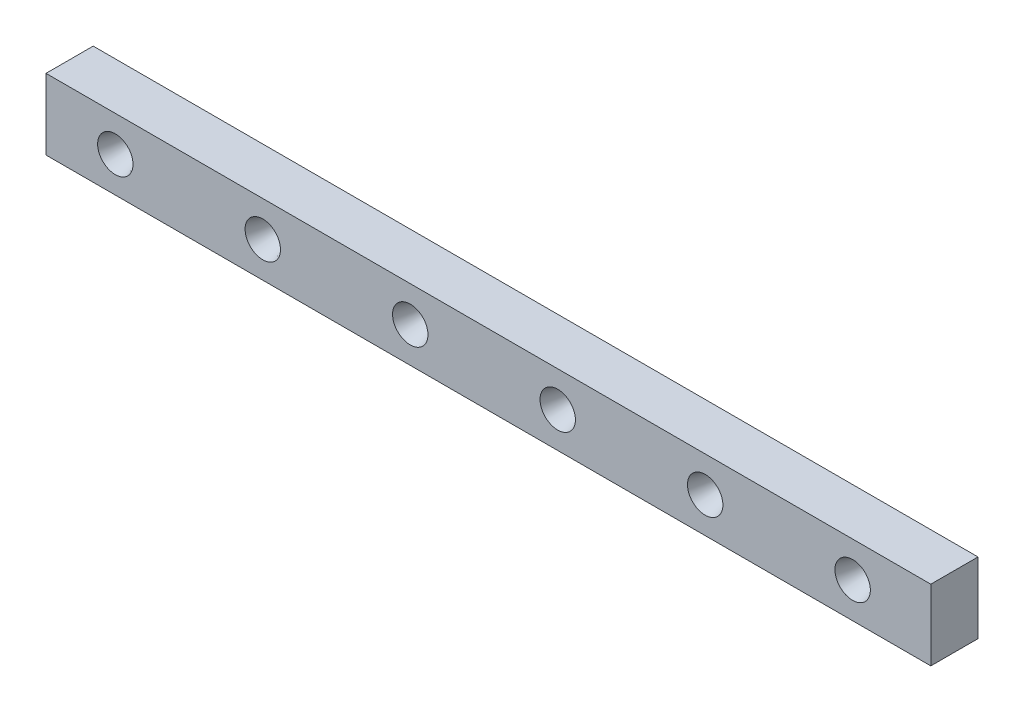
ISO-10303-21;
HEADER;
FILE_DESCRIPTION(('STEP AP214'),'2;1');
FILE_NAME('part.step','',(''),(''),'','','');
FILE_SCHEMA(('AUTOMOTIVE_DESIGN { 1 0 10303 214 1 1 1 1 }'));
ENDSEC;
DATA;
#1=APPLICATION_CONTEXT('core data for automotive mechanical design processes');
#2=APPLICATION_PROTOCOL_DEFINITION('international standard','automotive_design',2000,#1);
#3=PRODUCT_CONTEXT('',#1,'mechanical');
#4=PRODUCT('Part','Part','',(#3));
#5=PRODUCT_RELATED_PRODUCT_CATEGORY('part','',(#4));
#6=PRODUCT_DEFINITION_FORMATION('','',#4);
#7=PRODUCT_DEFINITION_CONTEXT('part definition',#1,'design');
#8=PRODUCT_DEFINITION('design','',#6,#7);
#9=PRODUCT_DEFINITION_SHAPE('','',#8);
#10=(LENGTH_UNIT() NAMED_UNIT(*) SI_UNIT(.MILLI.,.METRE.));
#11=(NAMED_UNIT(*) PLANE_ANGLE_UNIT() SI_UNIT($,.RADIAN.));
#12=(NAMED_UNIT(*) SI_UNIT($,.STERADIAN.) SOLID_ANGLE_UNIT());
#13=UNCERTAINTY_MEASURE_WITH_UNIT(LENGTH_MEASURE(1.E-05),#10,'distance_accuracy_value','');
#14=(GEOMETRIC_REPRESENTATION_CONTEXT(3) GLOBAL_UNCERTAINTY_ASSIGNED_CONTEXT((#13)) GLOBAL_UNIT_ASSIGNED_CONTEXT((#10,
#11,#12)) REPRESENTATION_CONTEXT('',''));
#15=CARTESIAN_POINT('',(0.,0.,0.));
#16=DIRECTION('',(0.,0.,1.));
#17=DIRECTION('',(1.,0.,0.));
#18=AXIS2_PLACEMENT_3D('',#15,#16,#17);
#19=CARTESIAN_POINT('',(150.,6.,4.));
#20=DIRECTION('',(0.,0.,-1.));
#21=DIRECTION('',(0.,1.,0.));
#22=AXIS2_PLACEMENT_3D('',#19,#20,#21);
#23=PLANE('',#22);
#24=CARTESIAN_POINT('',(136.75,0.,4.));
#25=DIRECTION('',(0.,0.,1.));
#26=DIRECTION('',(1.,0.,0.));
#27=AXIS2_PLACEMENT_3D('',#24,#25,#26);
#28=CIRCLE('',#27,3.);
#29=CARTESIAN_POINT('',(139.75,0.,4.));
#30=VERTEX_POINT('',#29);
#31=EDGE_CURVE('E187',#30,#30,#28,.T.);
#32=ORIENTED_EDGE('',*,*,#31,.F.);
#33=EDGE_LOOP('',(#32));
#34=FACE_BOUND('',#33,.T.);
#35=CARTESIAN_POINT('',(111.75,0.,4.));
#36=DIRECTION('',(0.,0.,1.));
#37=DIRECTION('',(1.,0.,0.));
#38=AXIS2_PLACEMENT_3D('',#35,#36,#37);
#39=CIRCLE('',#38,3.);
#40=CARTESIAN_POINT('',(114.75,0.,4.));
#41=VERTEX_POINT('',#40);
#42=EDGE_CURVE('E175',#41,#41,#39,.T.);
#43=ORIENTED_EDGE('',*,*,#42,.F.);
#44=EDGE_LOOP('',(#43));
#45=FACE_BOUND('',#44,.T.);
#46=CARTESIAN_POINT('',(86.75,0.,4.));
#47=DIRECTION('',(0.,0.,1.));
#48=DIRECTION('',(1.,0.,0.));
#49=AXIS2_PLACEMENT_3D('',#46,#47,#48);
#50=CIRCLE('',#49,3.);
#51=CARTESIAN_POINT('',(89.75,0.,4.));
#52=VERTEX_POINT('',#51);
#53=EDGE_CURVE('E163',#52,#52,#50,.T.);
#54=ORIENTED_EDGE('',*,*,#53,.F.);
#55=EDGE_LOOP('',(#54));
#56=FACE_BOUND('',#55,.T.);
#57=CARTESIAN_POINT('',(61.75,0.,4.));
#58=DIRECTION('',(0.,0.,1.));
#59=DIRECTION('',(1.,0.,0.));
#60=AXIS2_PLACEMENT_3D('',#57,#58,#59);
#61=CIRCLE('',#60,3.);
#62=CARTESIAN_POINT('',(64.75,0.,4.));
#63=VERTEX_POINT('',#62);
#64=EDGE_CURVE('E151',#63,#63,#61,.T.);
#65=ORIENTED_EDGE('',*,*,#64,.F.);
#66=EDGE_LOOP('',(#65));
#67=FACE_BOUND('',#66,.T.);
#68=CARTESIAN_POINT('',(36.75,0.,4.));
#69=DIRECTION('',(0.,0.,1.));
#70=DIRECTION('',(1.,0.,0.));
#71=AXIS2_PLACEMENT_3D('',#68,#69,#70);
#72=CIRCLE('',#71,3.);
#73=CARTESIAN_POINT('',(39.75,0.,4.));
#74=VERTEX_POINT('',#73);
#75=EDGE_CURVE('E139',#74,#74,#72,.T.);
#76=ORIENTED_EDGE('',*,*,#75,.F.);
#77=EDGE_LOOP('',(#76));
#78=FACE_BOUND('',#77,.T.);
#79=CARTESIAN_POINT('',(11.75,0.,4.));
#80=DIRECTION('',(0.,0.,1.));
#81=DIRECTION('',(1.,0.,0.));
#82=AXIS2_PLACEMENT_3D('',#79,#80,#81);
#83=CIRCLE('',#82,3.);
#84=CARTESIAN_POINT('',(14.75,0.,4.));
#85=VERTEX_POINT('',#84);
#86=EDGE_CURVE('E111',#85,#85,#83,.T.);
#87=ORIENTED_EDGE('',*,*,#86,.F.);
#88=EDGE_LOOP('',(#87));
#89=FACE_BOUND('',#88,.T.);
#90=DIRECTION('',(0.,-1.,0.));
#91=VECTOR('',#90,1.);
#92=CARTESIAN_POINT('',(0.,6.,4.));
#93=LINE('',#92,#91);
#94=CARTESIAN_POINT('',(0.,6.,4.));
#95=VERTEX_POINT('',#94);
#96=CARTESIAN_POINT('',(0.,-6.,4.));
#97=VERTEX_POINT('',#96);
#98=EDGE_CURVE('E107',#95,#97,#93,.T.);
#99=ORIENTED_EDGE('',*,*,#98,.T.);
#100=DIRECTION('',(-1.,0.,0.));
#101=VECTOR('',#100,1.);
#102=CARTESIAN_POINT('',(150.,-6.,4.));
#103=LINE('',#102,#101);
#104=CARTESIAN_POINT('',(150.,-6.,4.));
#105=VERTEX_POINT('',#104);
#106=EDGE_CURVE('E11',#105,#97,#103,.T.);
#107=ORIENTED_EDGE('',*,*,#106,.F.);
#108=DIRECTION('',(0.,-1.,0.));
#109=VECTOR('',#108,1.);
#110=CARTESIAN_POINT('',(150.,6.,4.));
#111=LINE('',#110,#109);
#112=CARTESIAN_POINT('',(150.,6.,4.));
#113=VERTEX_POINT('',#112);
#114=EDGE_CURVE('E91',#113,#105,#111,.T.);
#115=ORIENTED_EDGE('',*,*,#114,.F.);
#116=DIRECTION('',(-1.,0.,0.));
#117=VECTOR('',#116,1.);
#118=CARTESIAN_POINT('',(150.,6.,4.));
#119=LINE('',#118,#117);
#120=EDGE_CURVE('E103',#113,#95,#119,.T.);
#121=ORIENTED_EDGE('',*,*,#120,.T.);
#122=EDGE_LOOP('',(#99,#107,#115,#121));
#123=FACE_BOUND('',#122,.T.);
#124=ADVANCED_FACE('F39',(#34,#45,#56,#67,#78,#89,#123),#23,.F.);
#125=CARTESIAN_POINT('',(150.,-6.,4.));
#126=DIRECTION('',(0.,1.,0.));
#127=DIRECTION('',(0.,0.,1.));
#128=AXIS2_PLACEMENT_3D('',#125,#126,#127);
#129=PLANE('',#128);
#130=DIRECTION('',(0.,0.,-1.));
#131=VECTOR('',#130,1.);
#132=CARTESIAN_POINT('',(0.,-6.,4.));
#133=LINE('',#132,#131);
#134=CARTESIAN_POINT('',(0.,-6.,-4.));
#135=VERTEX_POINT('',#134);
#136=EDGE_CURVE('E96',#97,#135,#133,.T.);
#137=ORIENTED_EDGE('',*,*,#136,.T.);
#138=DIRECTION('',(-1.,0.,0.));
#139=VECTOR('',#138,1.);
#140=CARTESIAN_POINT('',(150.,-6.,-4.));
#141=LINE('',#140,#139);
#142=CARTESIAN_POINT('',(150.,-6.,-4.));
#143=VERTEX_POINT('',#142);
#144=EDGE_CURVE('E48',#143,#135,#141,.T.);
#145=ORIENTED_EDGE('',*,*,#144,.F.);
#146=DIRECTION('',(0.,0.,-1.));
#147=VECTOR('',#146,1.);
#148=CARTESIAN_POINT('',(150.,-6.,4.));
#149=LINE('',#148,#147);
#150=EDGE_CURVE('E86',#105,#143,#149,.T.);
#151=ORIENTED_EDGE('',*,*,#150,.F.);
#152=ORIENTED_EDGE('',*,*,#106,.T.);
#153=EDGE_LOOP('',(#137,#145,#151,#152));
#154=FACE_BOUND('',#153,.T.);
#155=ADVANCED_FACE('F95',(#154),#129,.F.);
#156=CARTESIAN_POINT('',(150.,6.,-4.));
#157=DIRECTION('',(0.,0.,1.));
#158=DIRECTION('',(0.,-1.,0.));
#159=AXIS2_PLACEMENT_3D('',#156,#157,#158);
#160=PLANE('',#159);
#161=CARTESIAN_POINT('',(136.75,0.,-4.));
#162=DIRECTION('',(0.,0.,1.));
#163=DIRECTION('',(1.,0.,0.));
#164=AXIS2_PLACEMENT_3D('',#161,#162,#163);
#165=CIRCLE('',#164,1.75);
#166=CARTESIAN_POINT('',(138.5,0.,-4.));
#167=VERTEX_POINT('',#166);
#168=EDGE_CURVE('E191',#167,#167,#165,.T.);
#169=ORIENTED_EDGE('',*,*,#168,.T.);
#170=EDGE_LOOP('',(#169));
#171=FACE_BOUND('',#170,.T.);
#172=CARTESIAN_POINT('',(111.75,0.,-4.));
#173=DIRECTION('',(0.,0.,1.));
#174=DIRECTION('',(1.,0.,0.));
#175=AXIS2_PLACEMENT_3D('',#172,#173,#174);
#176=CIRCLE('',#175,1.75);
#177=CARTESIAN_POINT('',(113.5,0.,-4.));
#178=VERTEX_POINT('',#177);
#179=EDGE_CURVE('E179',#178,#178,#176,.T.);
#180=ORIENTED_EDGE('',*,*,#179,.T.);
#181=EDGE_LOOP('',(#180));
#182=FACE_BOUND('',#181,.T.);
#183=CARTESIAN_POINT('',(86.75,0.,-4.));
#184=DIRECTION('',(0.,0.,1.));
#185=DIRECTION('',(1.,0.,0.));
#186=AXIS2_PLACEMENT_3D('',#183,#184,#185);
#187=CIRCLE('',#186,1.75);
#188=CARTESIAN_POINT('',(88.5,0.,-4.));
#189=VERTEX_POINT('',#188);
#190=EDGE_CURVE('E167',#189,#189,#187,.T.);
#191=ORIENTED_EDGE('',*,*,#190,.T.);
#192=EDGE_LOOP('',(#191));
#193=FACE_BOUND('',#192,.T.);
#194=CARTESIAN_POINT('',(61.75,0.,-4.));
#195=DIRECTION('',(0.,0.,1.));
#196=DIRECTION('',(1.,0.,0.));
#197=AXIS2_PLACEMENT_3D('',#194,#195,#196);
#198=CIRCLE('',#197,1.75);
#199=CARTESIAN_POINT('',(63.5,0.,-4.));
#200=VERTEX_POINT('',#199);
#201=EDGE_CURVE('E155',#200,#200,#198,.T.);
#202=ORIENTED_EDGE('',*,*,#201,.T.);
#203=EDGE_LOOP('',(#202));
#204=FACE_BOUND('',#203,.T.);
#205=CARTESIAN_POINT('',(36.75,0.,-4.));
#206=DIRECTION('',(0.,0.,1.));
#207=DIRECTION('',(1.,0.,0.));
#208=AXIS2_PLACEMENT_3D('',#205,#206,#207);
#209=CIRCLE('',#208,1.75);
#210=CARTESIAN_POINT('',(38.5,0.,-4.));
#211=VERTEX_POINT('',#210);
#212=EDGE_CURVE('E143',#211,#211,#209,.T.);
#213=ORIENTED_EDGE('',*,*,#212,.T.);
#214=EDGE_LOOP('',(#213));
#215=FACE_BOUND('',#214,.T.);
#216=CARTESIAN_POINT('',(11.75,0.,-4.));
#217=DIRECTION('',(0.,0.,1.));
#218=DIRECTION('',(1.,0.,0.));
#219=AXIS2_PLACEMENT_3D('',#216,#217,#218);
#220=CIRCLE('',#219,1.75);
#221=CARTESIAN_POINT('',(13.5,0.,-4.));
#222=VERTEX_POINT('',#221);
#223=EDGE_CURVE('E131',#222,#222,#220,.T.);
#224=ORIENTED_EDGE('',*,*,#223,.T.);
#225=EDGE_LOOP('',(#224));
#226=FACE_BOUND('',#225,.T.);
#227=DIRECTION('',(0.,1.,0.));
#228=VECTOR('',#227,1.);
#229=CARTESIAN_POINT('',(0.,6.,-4.));
#230=LINE('',#229,#228);
#231=CARTESIAN_POINT('',(0.,6.,-4.));
#232=VERTEX_POINT('',#231);
#233=EDGE_CURVE('E73',#135,#232,#230,.T.);
#234=ORIENTED_EDGE('',*,*,#233,.T.);
#235=DIRECTION('',(-1.,0.,0.));
#236=VECTOR('',#235,1.);
#237=CARTESIAN_POINT('',(150.,6.,-4.));
#238=LINE('',#237,#236);
#239=CARTESIAN_POINT('',(150.,6.,-4.));
#240=VERTEX_POINT('',#239);
#241=EDGE_CURVE('E98',#240,#232,#238,.T.);
#242=ORIENTED_EDGE('',*,*,#241,.F.);
#243=DIRECTION('',(0.,1.,0.));
#244=VECTOR('',#243,1.);
#245=CARTESIAN_POINT('',(150.,6.,-4.));
#246=LINE('',#245,#244);
#247=EDGE_CURVE('E89',#143,#240,#246,.T.);
#248=ORIENTED_EDGE('',*,*,#247,.F.);
#249=ORIENTED_EDGE('',*,*,#144,.T.);
#250=EDGE_LOOP('',(#234,#242,#248,#249));
#251=FACE_BOUND('',#250,.T.);
#252=ADVANCED_FACE('F99',(#171,#182,#193,#204,#215,#226,#251),#160,.F.);
#253=CARTESIAN_POINT('',(150.,6.,4.));
#254=DIRECTION('',(0.,-1.,0.));
#255=DIRECTION('',(0.,0.,-1.));
#256=AXIS2_PLACEMENT_3D('',#253,#254,#255);
#257=PLANE('',#256);
#258=DIRECTION('',(0.,0.,1.));
#259=VECTOR('',#258,1.);
#260=CARTESIAN_POINT('',(0.,6.,4.));
#261=LINE('',#260,#259);
#262=EDGE_CURVE('E79',#232,#95,#261,.T.);
#263=ORIENTED_EDGE('',*,*,#262,.T.);
#264=ORIENTED_EDGE('',*,*,#120,.F.);
#265=DIRECTION('',(0.,0.,1.));
#266=VECTOR('',#265,1.);
#267=CARTESIAN_POINT('',(150.,6.,4.));
#268=LINE('',#267,#266);
#269=EDGE_CURVE('E56',#240,#113,#268,.T.);
#270=ORIENTED_EDGE('',*,*,#269,.F.);
#271=ORIENTED_EDGE('',*,*,#241,.T.);
#272=EDGE_LOOP('',(#263,#264,#270,#271));
#273=FACE_BOUND('',#272,.T.);
#274=ADVANCED_FACE('F121',(#273),#257,.F.);
#275=CARTESIAN_POINT('',(150.,0.,0.));
#276=DIRECTION('',(1.,0.,0.));
#277=DIRECTION('',(0.,0.,-1.));
#278=AXIS2_PLACEMENT_3D('',#275,#276,#277);
#279=PLANE('',#278);
#280=ORIENTED_EDGE('',*,*,#114,.T.);
#281=ORIENTED_EDGE('',*,*,#150,.T.);
#282=ORIENTED_EDGE('',*,*,#247,.T.);
#283=ORIENTED_EDGE('',*,*,#269,.T.);
#284=EDGE_LOOP('',(#280,#281,#282,#283));
#285=FACE_BOUND('',#284,.T.);
#286=ADVANCED_FACE('F87',(#285),#279,.T.);
#287=CARTESIAN_POINT('',(0.,0.,0.));
#288=DIRECTION('',(1.,0.,0.));
#289=DIRECTION('',(0.,0.,-1.));
#290=AXIS2_PLACEMENT_3D('',#287,#288,#289);
#291=PLANE('',#290);
#292=ORIENTED_EDGE('',*,*,#98,.F.);
#293=ORIENTED_EDGE('',*,*,#262,.F.);
#294=ORIENTED_EDGE('',*,*,#233,.F.);
#295=ORIENTED_EDGE('',*,*,#136,.F.);
#296=EDGE_LOOP('',(#292,#293,#294,#295));
#297=FACE_BOUND('',#296,.T.);
#298=ADVANCED_FACE('F124',(#297),#291,.F.);
#299=CARTESIAN_POINT('',(11.75,0.,0.));
#300=DIRECTION('',(0.,0.,1.));
#301=DIRECTION('',(1.,0.,0.));
#302=AXIS2_PLACEMENT_3D('',#299,#300,#301);
#303=CONICAL_SURFACE('',#302,1.75,0.302884868374971);
#304=ORIENTED_EDGE('',*,*,#86,.T.);
#305=EDGE_LOOP('',(#304));
#306=FACE_BOUND('',#305,.T.);
#307=CARTESIAN_POINT('',(11.75,0.,0.));
#308=DIRECTION('',(0.,0.,1.));
#309=DIRECTION('',(1.,0.,0.));
#310=AXIS2_PLACEMENT_3D('',#307,#308,#309);
#311=CIRCLE('',#310,1.75);
#312=CARTESIAN_POINT('',(13.5,0.,0.));
#313=VERTEX_POINT('',#312);
#314=EDGE_CURVE('E135',#313,#313,#311,.T.);
#315=ORIENTED_EDGE('',*,*,#314,.F.);
#316=EDGE_LOOP('',(#315));
#317=FACE_BOUND('',#316,.T.);
#318=ADVANCED_FACE('F233',(#306,#317),#303,.F.);
#319=CARTESIAN_POINT('',(11.75,0.,4.));
#320=DIRECTION('',(0.,0.,1.));
#321=DIRECTION('',(1.,0.,0.));
#322=AXIS2_PLACEMENT_3D('',#319,#320,#321);
#323=CYLINDRICAL_SURFACE('',#322,1.75);
#324=ORIENTED_EDGE('',*,*,#314,.T.);
#325=EDGE_LOOP('',(#324));
#326=FACE_BOUND('',#325,.T.);
#327=ORIENTED_EDGE('',*,*,#223,.F.);
#328=EDGE_LOOP('',(#327));
#329=FACE_BOUND('',#328,.T.);
#330=ADVANCED_FACE('F236',(#326,#329),#323,.F.);
#331=CARTESIAN_POINT('',(36.75,0.,0.));
#332=DIRECTION('',(0.,0.,1.));
#333=DIRECTION('',(1.,0.,0.));
#334=AXIS2_PLACEMENT_3D('',#331,#332,#333);
#335=CONICAL_SURFACE('',#334,1.75,0.302884868374971);
#336=ORIENTED_EDGE('',*,*,#75,.T.);
#337=EDGE_LOOP('',(#336));
#338=FACE_BOUND('',#337,.T.);
#339=CARTESIAN_POINT('',(36.75,0.,0.));
#340=DIRECTION('',(0.,0.,1.));
#341=DIRECTION('',(1.,0.,0.));
#342=AXIS2_PLACEMENT_3D('',#339,#340,#341);
#343=CIRCLE('',#342,1.75);
#344=CARTESIAN_POINT('',(38.5,0.,0.));
#345=VERTEX_POINT('',#344);
#346=EDGE_CURVE('E147',#345,#345,#343,.T.);
#347=ORIENTED_EDGE('',*,*,#346,.F.);
#348=EDGE_LOOP('',(#347));
#349=FACE_BOUND('',#348,.T.);
#350=ADVANCED_FACE('F242',(#338,#349),#335,.F.);
#351=CARTESIAN_POINT('',(36.75,0.,4.));
#352=DIRECTION('',(0.,0.,1.));
#353=DIRECTION('',(1.,0.,0.));
#354=AXIS2_PLACEMENT_3D('',#351,#352,#353);
#355=CYLINDRICAL_SURFACE('',#354,1.75);
#356=ORIENTED_EDGE('',*,*,#346,.T.);
#357=EDGE_LOOP('',(#356));
#358=FACE_BOUND('',#357,.T.);
#359=ORIENTED_EDGE('',*,*,#212,.F.);
#360=EDGE_LOOP('',(#359));
#361=FACE_BOUND('',#360,.T.);
#362=ADVANCED_FACE('F261',(#358,#361),#355,.F.);
#363=CARTESIAN_POINT('',(61.75,0.,0.));
#364=DIRECTION('',(0.,0.,1.));
#365=DIRECTION('',(1.,0.,0.));
#366=AXIS2_PLACEMENT_3D('',#363,#364,#365);
#367=CONICAL_SURFACE('',#366,1.75,0.302884868374971);
#368=ORIENTED_EDGE('',*,*,#64,.T.);
#369=EDGE_LOOP('',(#368));
#370=FACE_BOUND('',#369,.T.);
#371=CARTESIAN_POINT('',(61.75,0.,0.));
#372=DIRECTION('',(0.,0.,1.));
#373=DIRECTION('',(1.,0.,0.));
#374=AXIS2_PLACEMENT_3D('',#371,#372,#373);
#375=CIRCLE('',#374,1.75);
#376=CARTESIAN_POINT('',(63.5,0.,0.));
#377=VERTEX_POINT('',#376);
#378=EDGE_CURVE('E159',#377,#377,#375,.T.);
#379=ORIENTED_EDGE('',*,*,#378,.F.);
#380=EDGE_LOOP('',(#379));
#381=FACE_BOUND('',#380,.T.);
#382=ADVANCED_FACE('F265',(#370,#381),#367,.F.);
#383=CARTESIAN_POINT('',(61.75,0.,4.));
#384=DIRECTION('',(0.,0.,1.));
#385=DIRECTION('',(1.,0.,0.));
#386=AXIS2_PLACEMENT_3D('',#383,#384,#385);
#387=CYLINDRICAL_SURFACE('',#386,1.75);
#388=ORIENTED_EDGE('',*,*,#378,.T.);
#389=EDGE_LOOP('',(#388));
#390=FACE_BOUND('',#389,.T.);
#391=ORIENTED_EDGE('',*,*,#201,.F.);
#392=EDGE_LOOP('',(#391));
#393=FACE_BOUND('',#392,.T.);
#394=ADVANCED_FACE('F269',(#390,#393),#387,.F.);
#395=CARTESIAN_POINT('',(86.75,0.,0.));
#396=DIRECTION('',(0.,0.,1.));
#397=DIRECTION('',(1.,0.,0.));
#398=AXIS2_PLACEMENT_3D('',#395,#396,#397);
#399=CONICAL_SURFACE('',#398,1.75,0.302884868374971);
#400=ORIENTED_EDGE('',*,*,#53,.T.);
#401=EDGE_LOOP('',(#400));
#402=FACE_BOUND('',#401,.T.);
#403=CARTESIAN_POINT('',(86.75,0.,0.));
#404=DIRECTION('',(0.,0.,1.));
#405=DIRECTION('',(1.,0.,0.));
#406=AXIS2_PLACEMENT_3D('',#403,#404,#405);
#407=CIRCLE('',#406,1.75);
#408=CARTESIAN_POINT('',(88.5,0.,0.));
#409=VERTEX_POINT('',#408);
#410=EDGE_CURVE('E171',#409,#409,#407,.T.);
#411=ORIENTED_EDGE('',*,*,#410,.F.);
#412=EDGE_LOOP('',(#411));
#413=FACE_BOUND('',#412,.T.);
#414=ADVANCED_FACE('F273',(#402,#413),#399,.F.);
#415=CARTESIAN_POINT('',(86.75,0.,4.));
#416=DIRECTION('',(0.,0.,1.));
#417=DIRECTION('',(1.,0.,0.));
#418=AXIS2_PLACEMENT_3D('',#415,#416,#417);
#419=CYLINDRICAL_SURFACE('',#418,1.75);
#420=ORIENTED_EDGE('',*,*,#410,.T.);
#421=EDGE_LOOP('',(#420));
#422=FACE_BOUND('',#421,.T.);
#423=ORIENTED_EDGE('',*,*,#190,.F.);
#424=EDGE_LOOP('',(#423));
#425=FACE_BOUND('',#424,.T.);
#426=ADVANCED_FACE('F277',(#422,#425),#419,.F.);
#427=CARTESIAN_POINT('',(111.75,0.,0.));
#428=DIRECTION('',(0.,0.,1.));
#429=DIRECTION('',(1.,0.,0.));
#430=AXIS2_PLACEMENT_3D('',#427,#428,#429);
#431=CONICAL_SURFACE('',#430,1.75,0.302884868374971);
#432=ORIENTED_EDGE('',*,*,#42,.T.);
#433=EDGE_LOOP('',(#432));
#434=FACE_BOUND('',#433,.T.);
#435=CARTESIAN_POINT('',(111.75,0.,0.));
#436=DIRECTION('',(0.,0.,1.));
#437=DIRECTION('',(1.,0.,0.));
#438=AXIS2_PLACEMENT_3D('',#435,#436,#437);
#439=CIRCLE('',#438,1.75);
#440=CARTESIAN_POINT('',(113.5,0.,0.));
#441=VERTEX_POINT('',#440);
#442=EDGE_CURVE('E183',#441,#441,#439,.T.);
#443=ORIENTED_EDGE('',*,*,#442,.F.);
#444=EDGE_LOOP('',(#443));
#445=FACE_BOUND('',#444,.T.);
#446=ADVANCED_FACE('F213',(#434,#445),#431,.F.);
#447=CARTESIAN_POINT('',(111.75,0.,4.));
#448=DIRECTION('',(0.,0.,1.));
#449=DIRECTION('',(1.,0.,0.));
#450=AXIS2_PLACEMENT_3D('',#447,#448,#449);
#451=CYLINDRICAL_SURFACE('',#450,1.75);
#452=ORIENTED_EDGE('',*,*,#442,.T.);
#453=EDGE_LOOP('',(#452));
#454=FACE_BOUND('',#453,.T.);
#455=ORIENTED_EDGE('',*,*,#179,.F.);
#456=EDGE_LOOP('',(#455));
#457=FACE_BOUND('',#456,.T.);
#458=ADVANCED_FACE('F205',(#454,#457),#451,.F.);
#459=CARTESIAN_POINT('',(136.75,0.,0.));
#460=DIRECTION('',(0.,0.,1.));
#461=DIRECTION('',(1.,0.,0.));
#462=AXIS2_PLACEMENT_3D('',#459,#460,#461);
#463=CONICAL_SURFACE('',#462,1.75,0.302884868374971);
#464=ORIENTED_EDGE('',*,*,#31,.T.);
#465=EDGE_LOOP('',(#464));
#466=FACE_BOUND('',#465,.T.);
#467=CARTESIAN_POINT('',(136.75,0.,0.));
#468=DIRECTION('',(0.,0.,1.));
#469=DIRECTION('',(1.,0.,0.));
#470=AXIS2_PLACEMENT_3D('',#467,#468,#469);
#471=CIRCLE('',#470,1.75);
#472=CARTESIAN_POINT('',(138.5,0.,0.));
#473=VERTEX_POINT('',#472);
#474=EDGE_CURVE('E195',#473,#473,#471,.T.);
#475=ORIENTED_EDGE('',*,*,#474,.F.);
#476=EDGE_LOOP('',(#475));
#477=FACE_BOUND('',#476,.T.);
#478=ADVANCED_FACE('F203',(#466,#477),#463,.F.);
#479=CARTESIAN_POINT('',(136.75,0.,4.));
#480=DIRECTION('',(0.,0.,1.));
#481=DIRECTION('',(1.,0.,0.));
#482=AXIS2_PLACEMENT_3D('',#479,#480,#481);
#483=CYLINDRICAL_SURFACE('',#482,1.75);
#484=ORIENTED_EDGE('',*,*,#474,.T.);
#485=EDGE_LOOP('',(#484));
#486=FACE_BOUND('',#485,.T.);
#487=ORIENTED_EDGE('',*,*,#168,.F.);
#488=EDGE_LOOP('',(#487));
#489=FACE_BOUND('',#488,.T.);
#490=ADVANCED_FACE('F200',(#486,#489),#483,.F.);
#491=CLOSED_SHELL('',(#124,#155,#252,#274,#286,#298,#318,#330,#350,#362,#382,#394,#414,#426,
#446,#458,#478,#490));
#492=MANIFOLD_SOLID_BREP('B2',#491);
#493=ADVANCED_BREP_SHAPE_REPRESENTATION('',(#18,#492),#14);
#494=SHAPE_DEFINITION_REPRESENTATION(#9,#493);
ENDSEC;
END-ISO-10303-21;
